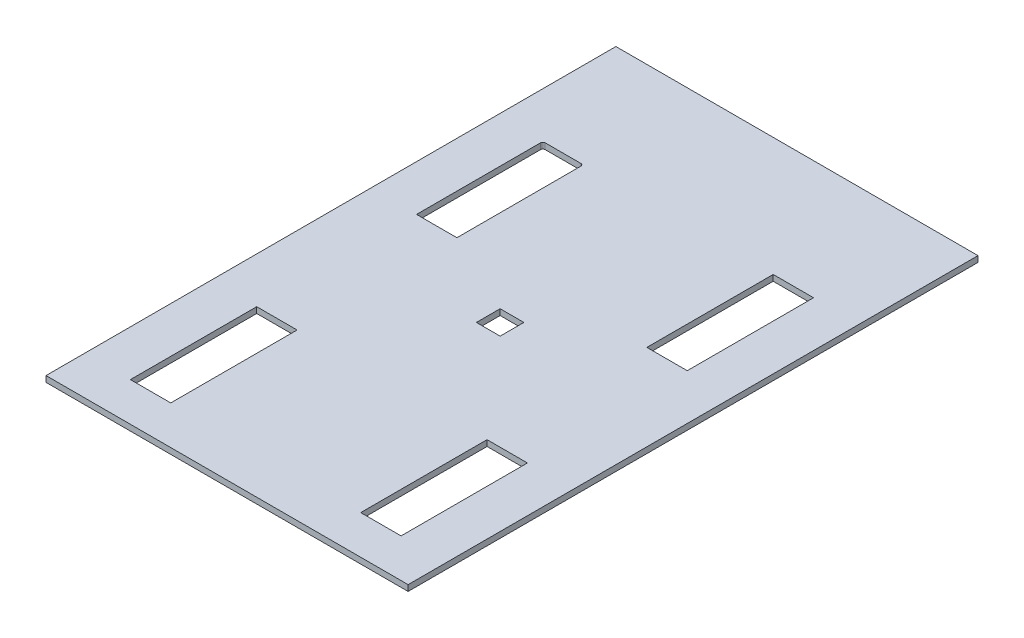
ISO-10303-21;
HEADER;
FILE_DESCRIPTION(('STEP AP214'),'2;1');
FILE_NAME('part.step','',(''),(''),'','','');
FILE_SCHEMA(('AUTOMOTIVE_DESIGN { 1 0 10303 214 1 1 1 1 }'));
ENDSEC;
DATA;
#1=APPLICATION_CONTEXT('core data for automotive mechanical design processes');
#2=APPLICATION_PROTOCOL_DEFINITION('international standard','automotive_design',2000,#1);
#3=PRODUCT_CONTEXT('',#1,'mechanical');
#4=PRODUCT('Part','Part','',(#3));
#5=PRODUCT_RELATED_PRODUCT_CATEGORY('part','',(#4));
#6=PRODUCT_DEFINITION_FORMATION('','',#4);
#7=PRODUCT_DEFINITION_CONTEXT('part definition',#1,'design');
#8=PRODUCT_DEFINITION('design','',#6,#7);
#9=PRODUCT_DEFINITION_SHAPE('','',#8);
#10=(LENGTH_UNIT() NAMED_UNIT(*) SI_UNIT(.MILLI.,.METRE.));
#11=(NAMED_UNIT(*) PLANE_ANGLE_UNIT() SI_UNIT($,.RADIAN.));
#12=(NAMED_UNIT(*) SI_UNIT($,.STERADIAN.) SOLID_ANGLE_UNIT());
#13=UNCERTAINTY_MEASURE_WITH_UNIT(LENGTH_MEASURE(1.E-05),#10,'distance_accuracy_value','');
#14=(GEOMETRIC_REPRESENTATION_CONTEXT(3) GLOBAL_UNCERTAINTY_ASSIGNED_CONTEXT((#13)) GLOBAL_UNIT_ASSIGNED_CONTEXT((#10,
#11,#12)) REPRESENTATION_CONTEXT('',''));
#15=CARTESIAN_POINT('',(0.,0.,0.));
#16=DIRECTION('',(0.,0.,1.));
#17=DIRECTION('',(1.,0.,0.));
#18=AXIS2_PLACEMENT_3D('',#15,#16,#17);
#19=CARTESIAN_POINT('',(0.,6.35,0.));
#20=DIRECTION('',(0.,-1.,0.));
#21=DIRECTION('',(0.,0.,-1.));
#22=AXIS2_PLACEMENT_3D('',#19,#20,#21);
#23=PLANE('',#22);
#24=DIRECTION('',(0.,0.,-1.));
#25=VECTOR('',#24,1.);
#26=CARTESIAN_POINT('',(193.675,6.35,304.8));
#27=LINE('',#26,#25);
#28=CARTESIAN_POINT('',(193.675,6.35,304.8));
#29=VERTEX_POINT('',#28);
#30=CARTESIAN_POINT('',(193.675,6.35,-304.8));
#31=VERTEX_POINT('',#30);
#32=EDGE_CURVE('E377',#29,#31,#27,.T.);
#33=ORIENTED_EDGE('',*,*,#32,.T.);
#34=DIRECTION('',(-1.,0.,0.));
#35=VECTOR('',#34,1.);
#36=CARTESIAN_POINT('',(-193.675,6.35,-304.8));
#37=LINE('',#36,#35);
#38=CARTESIAN_POINT('',(-193.675,6.35,-304.8));
#39=VERTEX_POINT('',#38);
#40=EDGE_CURVE('E380',#31,#39,#37,.T.);
#41=ORIENTED_EDGE('',*,*,#40,.T.);
#42=DIRECTION('',(0.,0.,1.));
#43=VECTOR('',#42,1.);
#44=CARTESIAN_POINT('',(-193.675,6.35,304.8));
#45=LINE('',#44,#43);
#46=CARTESIAN_POINT('',(-193.675,6.35,304.8));
#47=VERTEX_POINT('',#46);
#48=EDGE_CURVE('E383',#39,#47,#45,.T.);
#49=ORIENTED_EDGE('',*,*,#48,.T.);
#50=DIRECTION('',(1.,0.,0.));
#51=VECTOR('',#50,1.);
#52=CARTESIAN_POINT('',(-193.675,6.35,304.8));
#53=LINE('',#52,#51);
#54=EDGE_CURVE('E385',#47,#29,#53,.T.);
#55=ORIENTED_EDGE('',*,*,#54,.T.);
#56=EDGE_LOOP('',(#33,#41,#49,#55));
#57=FACE_BOUND('',#56,.T.);
#58=DIRECTION('',(-1.,0.,0.));
#59=VECTOR('',#58,1.);
#60=CARTESIAN_POINT('',(101.6,6.35,128.2954));
#61=LINE('',#60,#59);
#62=CARTESIAN_POINT('',(144.78,6.35,128.2954));
#63=VERTEX_POINT('',#62);
#64=CARTESIAN_POINT('',(101.6,6.35,128.2954));
#65=VERTEX_POINT('',#64);
#66=EDGE_CURVE('E360',#63,#65,#61,.T.);
#67=ORIENTED_EDGE('',*,*,#66,.F.);
#68=DIRECTION('',(0.,0.,-1.));
#69=VECTOR('',#68,1.);
#70=CARTESIAN_POINT('',(144.78,6.35,263.4234));
#71=LINE('',#70,#69);
#72=CARTESIAN_POINT('',(144.78,6.35,263.4234));
#73=VERTEX_POINT('',#72);
#74=EDGE_CURVE('E304',#73,#63,#71,.T.);
#75=ORIENTED_EDGE('',*,*,#74,.F.);
#76=DIRECTION('',(1.,0.,0.));
#77=VECTOR('',#76,1.);
#78=CARTESIAN_POINT('',(101.6,6.35,263.4234));
#79=LINE('',#78,#77);
#80=CARTESIAN_POINT('',(101.6,6.35,263.4234));
#81=VERTEX_POINT('',#80);
#82=EDGE_CURVE('E349',#81,#73,#79,.T.);
#83=ORIENTED_EDGE('',*,*,#82,.F.);
#84=DIRECTION('',(0.,0.,1.));
#85=VECTOR('',#84,1.);
#86=CARTESIAN_POINT('',(101.6,6.35,263.4234));
#87=LINE('',#86,#85);
#88=EDGE_CURVE('E363',#65,#81,#87,.T.);
#89=ORIENTED_EDGE('',*,*,#88,.F.);
#90=EDGE_LOOP('',(#67,#75,#83,#89));
#91=FACE_BOUND('',#90,.T.);
#92=DIRECTION('',(0.,0.,-1.));
#93=VECTOR('',#92,1.);
#94=CARTESIAN_POINT('',(-101.6,6.35,-42.672));
#95=LINE('',#94,#93);
#96=CARTESIAN_POINT('',(-101.6,6.35,-42.672));
#97=VERTEX_POINT('',#96);
#98=CARTESIAN_POINT('',(-101.6,6.35,-175.26));
#99=VERTEX_POINT('',#98);
#100=EDGE_CURVE('E268',#97,#99,#95,.T.);
#101=ORIENTED_EDGE('',*,*,#100,.F.);
#102=DIRECTION('',(1.,0.,0.));
#103=VECTOR('',#102,1.);
#104=CARTESIAN_POINT('',(-101.6,6.35,-42.672));
#105=LINE('',#104,#103);
#106=CARTESIAN_POINT('',(-144.78,6.35,-42.672));
#107=VERTEX_POINT('',#106);
#108=EDGE_CURVE('E270',#107,#97,#105,.T.);
#109=ORIENTED_EDGE('',*,*,#108,.F.);
#110=DIRECTION('',(0.,0.,1.));
#111=VECTOR('',#110,1.);
#112=CARTESIAN_POINT('',(-144.78,6.35,-42.672));
#113=LINE('',#112,#111);
#114=CARTESIAN_POINT('',(-144.78,6.35,-175.26));
#115=VERTEX_POINT('',#114);
#116=EDGE_CURVE('E262',#115,#107,#113,.T.);
#117=ORIENTED_EDGE('',*,*,#116,.F.);
#118=CARTESIAN_POINT('',(-142.24,6.35,-175.26));
#119=DIRECTION('',(0.,-1.,0.));
#120=DIRECTION('',(0.,0.,-1.));
#121=AXIS2_PLACEMENT_3D('',#118,#119,#120);
#122=CIRCLE('',#121,2.54);
#123=CARTESIAN_POINT('',(-142.24,6.35,-177.8));
#124=VERTEX_POINT('',#123);
#125=EDGE_CURVE('E415',#115,#124,#122,.T.);
#126=ORIENTED_EDGE('',*,*,#125,.T.);
#127=DIRECTION('',(-1.,0.,0.));
#128=VECTOR('',#127,1.);
#129=CARTESIAN_POINT('',(-101.6,6.35,-177.8));
#130=LINE('',#129,#128);
#131=CARTESIAN_POINT('',(-104.14,6.35,-177.8));
#132=VERTEX_POINT('',#131);
#133=EDGE_CURVE('E264',#132,#124,#130,.T.);
#134=ORIENTED_EDGE('',*,*,#133,.F.);
#135=CARTESIAN_POINT('',(-104.14,6.35,-175.26));
#136=DIRECTION('',(0.,-1.,0.));
#137=DIRECTION('',(0.,0.,-1.));
#138=AXIS2_PLACEMENT_3D('',#135,#136,#137);
#139=CIRCLE('',#138,2.54);
#140=EDGE_CURVE('E49',#132,#99,#139,.T.);
#141=ORIENTED_EDGE('',*,*,#140,.T.);
#142=EDGE_LOOP('',(#101,#109,#117,#126,#134,#141));
#143=FACE_BOUND('',#142,.T.);
#144=DIRECTION('',(0.,0.,-1.));
#145=VECTOR('',#144,1.);
#146=CARTESIAN_POINT('',(-101.6,6.35,263.4234));
#147=LINE('',#146,#145);
#148=CARTESIAN_POINT('',(-101.6,6.35,263.4234));
#149=VERTEX_POINT('',#148);
#150=CARTESIAN_POINT('',(-101.6,6.35,128.2954));
#151=VERTEX_POINT('',#150);
#152=EDGE_CURVE('E331',#149,#151,#147,.T.);
#153=ORIENTED_EDGE('',*,*,#152,.F.);
#154=DIRECTION('',(1.,0.,0.));
#155=VECTOR('',#154,1.);
#156=CARTESIAN_POINT('',(-101.6,6.35,263.4234));
#157=LINE('',#156,#155);
#158=CARTESIAN_POINT('',(-144.78,6.35,263.4234));
#159=VERTEX_POINT('',#158);
#160=EDGE_CURVE('E291',#159,#149,#157,.T.);
#161=ORIENTED_EDGE('',*,*,#160,.F.);
#162=DIRECTION('',(0.,0.,1.));
#163=VECTOR('',#162,1.);
#164=CARTESIAN_POINT('',(-144.78,6.35,263.4234));
#165=LINE('',#164,#163);
#166=CARTESIAN_POINT('',(-144.78,6.35,128.2954));
#167=VERTEX_POINT('',#166);
#168=EDGE_CURVE('E324',#167,#159,#165,.T.);
#169=ORIENTED_EDGE('',*,*,#168,.F.);
#170=DIRECTION('',(-1.,0.,0.));
#171=VECTOR('',#170,1.);
#172=CARTESIAN_POINT('',(-101.6,6.35,128.2954));
#173=LINE('',#172,#171);
#174=EDGE_CURVE('E327',#151,#167,#173,.T.);
#175=ORIENTED_EDGE('',*,*,#174,.F.);
#176=EDGE_LOOP('',(#153,#161,#169,#175));
#177=FACE_BOUND('',#176,.T.);
#178=DIRECTION('',(-1.,0.,0.));
#179=VECTOR('',#178,1.);
#180=CARTESIAN_POINT('',(101.6,6.35,-177.8));
#181=LINE('',#180,#179);
#182=CARTESIAN_POINT('',(144.78,6.35,-177.8));
#183=VERTEX_POINT('',#182);
#184=CARTESIAN_POINT('',(101.6,6.35,-177.8));
#185=VERTEX_POINT('',#184);
#186=EDGE_CURVE('E299',#183,#185,#181,.T.);
#187=ORIENTED_EDGE('',*,*,#186,.F.);
#188=DIRECTION('',(0.,0.,-1.));
#189=VECTOR('',#188,1.);
#190=CARTESIAN_POINT('',(144.78,6.35,-42.672));
#191=LINE('',#190,#189);
#192=CARTESIAN_POINT('',(144.78,6.35,-42.672));
#193=VERTEX_POINT('',#192);
#194=EDGE_CURVE('E302',#193,#183,#191,.T.);
#195=ORIENTED_EDGE('',*,*,#194,.F.);
#196=DIRECTION('',(1.,0.,0.));
#197=VECTOR('',#196,1.);
#198=CARTESIAN_POINT('',(101.6,6.35,-42.672));
#199=LINE('',#198,#197);
#200=CARTESIAN_POINT('',(101.6,6.35,-42.672));
#201=VERTEX_POINT('',#200);
#202=EDGE_CURVE('E292',#201,#193,#199,.T.);
#203=ORIENTED_EDGE('',*,*,#202,.F.);
#204=DIRECTION('',(0.,0.,1.));
#205=VECTOR('',#204,1.);
#206=CARTESIAN_POINT('',(101.6,6.35,-42.672));
#207=LINE('',#206,#205);
#208=EDGE_CURVE('E295',#185,#201,#207,.T.);
#209=ORIENTED_EDGE('',*,*,#208,.F.);
#210=EDGE_LOOP('',(#187,#195,#203,#209));
#211=FACE_BOUND('',#210,.T.);
#212=DIRECTION('',(0.,0.,-1.));
#213=VECTOR('',#212,1.);
#214=CARTESIAN_POINT('',(12.7,6.35,25.4));
#215=LINE('',#214,#213);
#216=CARTESIAN_POINT('',(12.7,6.35,25.4));
#217=VERTEX_POINT('',#216);
#218=CARTESIAN_POINT('',(12.7,6.35,0.));
#219=VERTEX_POINT('',#218);
#220=EDGE_CURVE('E215',#217,#219,#215,.T.);
#221=ORIENTED_EDGE('',*,*,#220,.F.);
#222=DIRECTION('',(1.,0.,0.));
#223=VECTOR('',#222,1.);
#224=CARTESIAN_POINT('',(-12.7,6.35,25.4));
#225=LINE('',#224,#223);
#226=CARTESIAN_POINT('',(-12.7,6.35,25.4));
#227=VERTEX_POINT('',#226);
#228=EDGE_CURVE('E240',#227,#217,#225,.T.);
#229=ORIENTED_EDGE('',*,*,#228,.F.);
#230=DIRECTION('',(0.,0.,1.));
#231=VECTOR('',#230,1.);
#232=CARTESIAN_POINT('',(-12.7,6.35,25.4));
#233=LINE('',#232,#231);
#234=CARTESIAN_POINT('',(-12.7,6.35,0.));
#235=VERTEX_POINT('',#234);
#236=EDGE_CURVE('E238',#235,#227,#233,.T.);
#237=ORIENTED_EDGE('',*,*,#236,.F.);
#238=DIRECTION('',(-1.,0.,0.));
#239=VECTOR('',#238,1.);
#240=CARTESIAN_POINT('',(-12.7,6.35,0.));
#241=LINE('',#240,#239);
#242=EDGE_CURVE('E225',#219,#235,#241,.T.);
#243=ORIENTED_EDGE('',*,*,#242,.F.);
#244=EDGE_LOOP('',(#221,#229,#237,#243));
#245=FACE_BOUND('',#244,.T.);
#246=ADVANCED_FACE('F41',(#57,#91,#143,#177,#211,#245),#23,.F.);
#247=CARTESIAN_POINT('',(0.,0.,0.));
#248=DIRECTION('',(0.,-1.,0.));
#249=DIRECTION('',(0.,0.,-1.));
#250=AXIS2_PLACEMENT_3D('',#247,#248,#249);
#251=PLANE('',#250);
#252=DIRECTION('',(0.,0.,-1.));
#253=VECTOR('',#252,1.);
#254=CARTESIAN_POINT('',(144.78,0.,-42.672));
#255=LINE('',#254,#253);
#256=CARTESIAN_POINT('',(144.78,0.,-42.672));
#257=VERTEX_POINT('',#256);
#258=CARTESIAN_POINT('',(144.78,0.,-177.8));
#259=VERTEX_POINT('',#258);
#260=EDGE_CURVE('E296',#257,#259,#255,.T.);
#261=ORIENTED_EDGE('',*,*,#260,.T.);
#262=DIRECTION('',(-1.,0.,0.));
#263=VECTOR('',#262,1.);
#264=CARTESIAN_POINT('',(101.6,0.,-177.8));
#265=LINE('',#264,#263);
#266=CARTESIAN_POINT('',(101.6,0.,-177.8));
#267=VERTEX_POINT('',#266);
#268=EDGE_CURVE('E310',#259,#267,#265,.T.);
#269=ORIENTED_EDGE('',*,*,#268,.T.);
#270=DIRECTION('',(0.,0.,1.));
#271=VECTOR('',#270,1.);
#272=CARTESIAN_POINT('',(101.6,0.,-42.672));
#273=LINE('',#272,#271);
#274=CARTESIAN_POINT('',(101.6,0.,-42.672));
#275=VERTEX_POINT('',#274);
#276=EDGE_CURVE('E307',#267,#275,#273,.T.);
#277=ORIENTED_EDGE('',*,*,#276,.T.);
#278=DIRECTION('',(1.,0.,0.));
#279=VECTOR('',#278,1.);
#280=CARTESIAN_POINT('',(101.6,0.,-42.672));
#281=LINE('',#280,#279);
#282=EDGE_CURVE('E284',#275,#257,#281,.T.);
#283=ORIENTED_EDGE('',*,*,#282,.T.);
#284=EDGE_LOOP('',(#261,#269,#277,#283));
#285=FACE_BOUND('',#284,.T.);
#286=DIRECTION('',(1.,0.,0.));
#287=VECTOR('',#286,1.);
#288=CARTESIAN_POINT('',(-101.6,0.,263.4234));
#289=LINE('',#288,#287);
#290=CARTESIAN_POINT('',(-144.78,0.,263.4234));
#291=VERTEX_POINT('',#290);
#292=CARTESIAN_POINT('',(-101.6,0.,263.4234));
#293=VERTEX_POINT('',#292);
#294=EDGE_CURVE('E328',#291,#293,#289,.T.);
#295=ORIENTED_EDGE('',*,*,#294,.T.);
#296=DIRECTION('',(0.,0.,-1.));
#297=VECTOR('',#296,1.);
#298=CARTESIAN_POINT('',(-101.6,0.,263.4234));
#299=LINE('',#298,#297);
#300=CARTESIAN_POINT('',(-101.6,0.,128.2954));
#301=VERTEX_POINT('',#300);
#302=EDGE_CURVE('E340',#293,#301,#299,.T.);
#303=ORIENTED_EDGE('',*,*,#302,.T.);
#304=DIRECTION('',(-1.,0.,0.));
#305=VECTOR('',#304,1.);
#306=CARTESIAN_POINT('',(-101.6,0.,128.2954));
#307=LINE('',#306,#305);
#308=CARTESIAN_POINT('',(-144.78,0.,128.2954));
#309=VERTEX_POINT('',#308);
#310=EDGE_CURVE('E337',#301,#309,#307,.T.);
#311=ORIENTED_EDGE('',*,*,#310,.T.);
#312=DIRECTION('',(0.,0.,1.));
#313=VECTOR('',#312,1.);
#314=CARTESIAN_POINT('',(-144.78,0.,263.4234));
#315=LINE('',#314,#313);
#316=EDGE_CURVE('E318',#309,#291,#315,.T.);
#317=ORIENTED_EDGE('',*,*,#316,.T.);
#318=EDGE_LOOP('',(#295,#303,#311,#317));
#319=FACE_BOUND('',#318,.T.);
#320=DIRECTION('',(1.,0.,0.));
#321=VECTOR('',#320,1.);
#322=CARTESIAN_POINT('',(-101.6,0.,-42.672));
#323=LINE('',#322,#321);
#324=CARTESIAN_POINT('',(-144.78,0.,-42.672));
#325=VERTEX_POINT('',#324);
#326=CARTESIAN_POINT('',(-101.6,0.,-42.672));
#327=VERTEX_POINT('',#326);
#328=EDGE_CURVE('E265',#325,#327,#323,.T.);
#329=ORIENTED_EDGE('',*,*,#328,.T.);
#330=DIRECTION('',(0.,0.,-1.));
#331=VECTOR('',#330,1.);
#332=CARTESIAN_POINT('',(-101.6,0.,-42.672));
#333=LINE('',#332,#331);
#334=CARTESIAN_POINT('',(-101.6,0.,-175.26));
#335=VERTEX_POINT('',#334);
#336=EDGE_CURVE('E277',#327,#335,#333,.T.);
#337=ORIENTED_EDGE('',*,*,#336,.T.);
#338=CARTESIAN_POINT('',(-104.14,0.,-175.26));
#339=DIRECTION('',(0.,-1.,0.));
#340=DIRECTION('',(0.,0.,-1.));
#341=AXIS2_PLACEMENT_3D('',#338,#339,#340);
#342=CIRCLE('',#341,2.54);
#343=CARTESIAN_POINT('',(-104.14,0.,-177.8));
#344=VERTEX_POINT('',#343);
#345=EDGE_CURVE('E11',#335,#344,#342,.F.);
#346=ORIENTED_EDGE('',*,*,#345,.T.);
#347=DIRECTION('',(-1.,0.,0.));
#348=VECTOR('',#347,1.);
#349=CARTESIAN_POINT('',(-101.6,0.,-177.8));
#350=LINE('',#349,#348);
#351=CARTESIAN_POINT('',(-142.24,0.,-177.8));
#352=VERTEX_POINT('',#351);
#353=EDGE_CURVE('E274',#344,#352,#350,.T.);
#354=ORIENTED_EDGE('',*,*,#353,.T.);
#355=CARTESIAN_POINT('',(-142.24,0.,-175.26));
#356=DIRECTION('',(0.,-1.,0.));
#357=DIRECTION('',(0.,0.,-1.));
#358=AXIS2_PLACEMENT_3D('',#355,#356,#357);
#359=CIRCLE('',#358,2.54);
#360=CARTESIAN_POINT('',(-144.78,0.,-175.26));
#361=VERTEX_POINT('',#360);
#362=EDGE_CURVE('E417',#352,#361,#359,.F.);
#363=ORIENTED_EDGE('',*,*,#362,.T.);
#364=DIRECTION('',(0.,0.,1.));
#365=VECTOR('',#364,1.);
#366=CARTESIAN_POINT('',(-144.78,0.,-42.672));
#367=LINE('',#366,#365);
#368=EDGE_CURVE('E259',#361,#325,#367,.T.);
#369=ORIENTED_EDGE('',*,*,#368,.T.);
#370=EDGE_LOOP('',(#329,#337,#346,#354,#363,#369));
#371=FACE_BOUND('',#370,.T.);
#372=DIRECTION('',(0.,0.,-1.));
#373=VECTOR('',#372,1.);
#374=CARTESIAN_POINT('',(144.78,0.,263.4234));
#375=LINE('',#374,#373);
#376=CARTESIAN_POINT('',(144.78,0.,263.4234));
#377=VERTEX_POINT('',#376);
#378=CARTESIAN_POINT('',(144.78,0.,128.2954));
#379=VERTEX_POINT('',#378);
#380=EDGE_CURVE('E345',#377,#379,#375,.T.);
#381=ORIENTED_EDGE('',*,*,#380,.T.);
#382=DIRECTION('',(-1.,0.,0.));
#383=VECTOR('',#382,1.);
#384=CARTESIAN_POINT('',(101.6,0.,128.2954));
#385=LINE('',#384,#383);
#386=CARTESIAN_POINT('',(101.6,0.,128.2954));
#387=VERTEX_POINT('',#386);
#388=EDGE_CURVE('E348',#379,#387,#385,.T.);
#389=ORIENTED_EDGE('',*,*,#388,.T.);
#390=DIRECTION('',(0.,0.,1.));
#391=VECTOR('',#390,1.);
#392=CARTESIAN_POINT('',(101.6,0.,263.4234));
#393=LINE('',#392,#391);
#394=CARTESIAN_POINT('',(101.6,0.,263.4234));
#395=VERTEX_POINT('',#394);
#396=EDGE_CURVE('E352',#387,#395,#393,.T.);
#397=ORIENTED_EDGE('',*,*,#396,.T.);
#398=DIRECTION('',(1.,0.,0.));
#399=VECTOR('',#398,1.);
#400=CARTESIAN_POINT('',(101.6,0.,263.4234));
#401=LINE('',#400,#399);
#402=EDGE_CURVE('E355',#395,#377,#401,.T.);
#403=ORIENTED_EDGE('',*,*,#402,.T.);
#404=EDGE_LOOP('',(#381,#389,#397,#403));
#405=FACE_BOUND('',#404,.T.);
#406=DIRECTION('',(0.,0.,-1.));
#407=VECTOR('',#406,1.);
#408=CARTESIAN_POINT('',(193.675,0.,304.8));
#409=LINE('',#408,#407);
#410=CARTESIAN_POINT('',(193.675,0.,304.8));
#411=VERTEX_POINT('',#410);
#412=CARTESIAN_POINT('',(193.675,0.,-304.8));
#413=VERTEX_POINT('',#412);
#414=EDGE_CURVE('E370',#411,#413,#409,.T.);
#415=ORIENTED_EDGE('',*,*,#414,.F.);
#416=DIRECTION('',(1.,0.,0.));
#417=VECTOR('',#416,1.);
#418=CARTESIAN_POINT('',(-193.675,0.,304.8));
#419=LINE('',#418,#417);
#420=CARTESIAN_POINT('',(-193.675,0.,304.8));
#421=VERTEX_POINT('',#420);
#422=EDGE_CURVE('E381',#421,#411,#419,.T.);
#423=ORIENTED_EDGE('',*,*,#422,.F.);
#424=DIRECTION('',(0.,0.,1.));
#425=VECTOR('',#424,1.);
#426=CARTESIAN_POINT('',(-193.675,0.,304.8));
#427=LINE('',#426,#425);
#428=CARTESIAN_POINT('',(-193.675,0.,-304.8));
#429=VERTEX_POINT('',#428);
#430=EDGE_CURVE('E392',#429,#421,#427,.T.);
#431=ORIENTED_EDGE('',*,*,#430,.F.);
#432=DIRECTION('',(-1.,0.,0.));
#433=VECTOR('',#432,1.);
#434=CARTESIAN_POINT('',(-193.675,0.,-304.8));
#435=LINE('',#434,#433);
#436=EDGE_CURVE('E390',#413,#429,#435,.T.);
#437=ORIENTED_EDGE('',*,*,#436,.F.);
#438=EDGE_LOOP('',(#415,#423,#431,#437));
#439=FACE_BOUND('',#438,.T.);
#440=DIRECTION('',(1.,0.,0.));
#441=VECTOR('',#440,1.);
#442=CARTESIAN_POINT('',(-12.7,0.,25.4));
#443=LINE('',#442,#441);
#444=CARTESIAN_POINT('',(-12.7,0.,25.4));
#445=VERTEX_POINT('',#444);
#446=CARTESIAN_POINT('',(12.7,0.,25.4));
#447=VERTEX_POINT('',#446);
#448=EDGE_CURVE('E226',#445,#447,#443,.T.);
#449=ORIENTED_EDGE('',*,*,#448,.T.);
#450=DIRECTION('',(0.,0.,-1.));
#451=VECTOR('',#450,1.);
#452=CARTESIAN_POINT('',(12.7,0.,25.4));
#453=LINE('',#452,#451);
#454=CARTESIAN_POINT('',(12.7,0.,0.));
#455=VERTEX_POINT('',#454);
#456=EDGE_CURVE('E244',#447,#455,#453,.T.);
#457=ORIENTED_EDGE('',*,*,#456,.T.);
#458=DIRECTION('',(-1.,0.,0.));
#459=VECTOR('',#458,1.);
#460=CARTESIAN_POINT('',(-12.7,0.,0.));
#461=LINE('',#460,#459);
#462=CARTESIAN_POINT('',(-12.7,0.,0.));
#463=VERTEX_POINT('',#462);
#464=EDGE_CURVE('E232',#455,#463,#461,.T.);
#465=ORIENTED_EDGE('',*,*,#464,.T.);
#466=DIRECTION('',(0.,0.,1.));
#467=VECTOR('',#466,1.);
#468=CARTESIAN_POINT('',(-12.7,0.,25.4));
#469=LINE('',#468,#467);
#470=EDGE_CURVE('E247',#463,#445,#469,.T.);
#471=ORIENTED_EDGE('',*,*,#470,.T.);
#472=EDGE_LOOP('',(#449,#457,#465,#471));
#473=FACE_BOUND('',#472,.T.);
#474=ADVANCED_FACE('F421',(#285,#319,#371,#405,#439,#473),#251,.T.);
#475=CARTESIAN_POINT('',(193.675,6.35,304.8));
#476=DIRECTION('',(-1.,0.,0.));
#477=DIRECTION('',(0.,0.,1.));
#478=AXIS2_PLACEMENT_3D('',#475,#476,#477);
#479=PLANE('',#478);
#480=ORIENTED_EDGE('',*,*,#414,.T.);
#481=DIRECTION('',(0.,-1.,0.));
#482=VECTOR('',#481,1.);
#483=CARTESIAN_POINT('',(193.675,6.35,-304.8));
#484=LINE('',#483,#482);
#485=EDGE_CURVE('E403',#31,#413,#484,.T.);
#486=ORIENTED_EDGE('',*,*,#485,.F.);
#487=ORIENTED_EDGE('',*,*,#32,.F.);
#488=DIRECTION('',(0.,-1.,0.));
#489=VECTOR('',#488,1.);
#490=CARTESIAN_POINT('',(193.675,6.35,304.8));
#491=LINE('',#490,#489);
#492=EDGE_CURVE('E387',#29,#411,#491,.T.);
#493=ORIENTED_EDGE('',*,*,#492,.T.);
#494=EDGE_LOOP('',(#480,#486,#487,#493));
#495=FACE_BOUND('',#494,.T.);
#496=ADVANCED_FACE('F463',(#495),#479,.F.);
#497=CARTESIAN_POINT('',(-193.675,6.35,-304.8));
#498=DIRECTION('',(0.,0.,1.));
#499=DIRECTION('',(1.,0.,0.));
#500=AXIS2_PLACEMENT_3D('',#497,#498,#499);
#501=PLANE('',#500);
#502=ORIENTED_EDGE('',*,*,#436,.T.);
#503=DIRECTION('',(0.,-1.,0.));
#504=VECTOR('',#503,1.);
#505=CARTESIAN_POINT('',(-193.675,6.35,-304.8));
#506=LINE('',#505,#504);
#507=EDGE_CURVE('E400',#39,#429,#506,.T.);
#508=ORIENTED_EDGE('',*,*,#507,.F.);
#509=ORIENTED_EDGE('',*,*,#40,.F.);
#510=ORIENTED_EDGE('',*,*,#485,.T.);
#511=EDGE_LOOP('',(#502,#508,#509,#510));
#512=FACE_BOUND('',#511,.T.);
#513=ADVANCED_FACE('F477',(#512),#501,.F.);
#514=CARTESIAN_POINT('',(-193.675,6.35,304.8));
#515=DIRECTION('',(1.,0.,0.));
#516=DIRECTION('',(0.,0.,-1.));
#517=AXIS2_PLACEMENT_3D('',#514,#515,#516);
#518=PLANE('',#517);
#519=ORIENTED_EDGE('',*,*,#430,.T.);
#520=DIRECTION('',(0.,-1.,0.));
#521=VECTOR('',#520,1.);
#522=CARTESIAN_POINT('',(-193.675,6.35,304.8));
#523=LINE('',#522,#521);
#524=EDGE_CURVE('E397',#47,#421,#523,.T.);
#525=ORIENTED_EDGE('',*,*,#524,.F.);
#526=ORIENTED_EDGE('',*,*,#48,.F.);
#527=ORIENTED_EDGE('',*,*,#507,.T.);
#528=EDGE_LOOP('',(#519,#525,#526,#527));
#529=FACE_BOUND('',#528,.T.);
#530=ADVANCED_FACE('F473',(#529),#518,.F.);
#531=CARTESIAN_POINT('',(-193.675,6.35,304.8));
#532=DIRECTION('',(0.,0.,-1.));
#533=DIRECTION('',(-1.,0.,0.));
#534=AXIS2_PLACEMENT_3D('',#531,#532,#533);
#535=PLANE('',#534);
#536=ORIENTED_EDGE('',*,*,#422,.T.);
#537=ORIENTED_EDGE('',*,*,#492,.F.);
#538=ORIENTED_EDGE('',*,*,#54,.F.);
#539=ORIENTED_EDGE('',*,*,#524,.T.);
#540=EDGE_LOOP('',(#536,#537,#538,#539));
#541=FACE_BOUND('',#540,.T.);
#542=ADVANCED_FACE('F470',(#541),#535,.F.);
#543=CARTESIAN_POINT('',(144.78,0.,263.4234));
#544=DIRECTION('',(1.,0.,0.));
#545=DIRECTION('',(0.,0.,-1.));
#546=AXIS2_PLACEMENT_3D('',#543,#544,#545);
#547=PLANE('',#546);
#548=ORIENTED_EDGE('',*,*,#74,.T.);
#549=DIRECTION('',(0.,1.,0.));
#550=VECTOR('',#549,1.);
#551=CARTESIAN_POINT('',(144.78,0.,128.2954));
#552=LINE('',#551,#550);
#553=EDGE_CURVE('E358',#379,#63,#552,.T.);
#554=ORIENTED_EDGE('',*,*,#553,.F.);
#555=ORIENTED_EDGE('',*,*,#380,.F.);
#556=DIRECTION('',(0.,1.,0.));
#557=VECTOR('',#556,1.);
#558=CARTESIAN_POINT('',(144.78,0.,263.4234));
#559=LINE('',#558,#557);
#560=EDGE_CURVE('E368',#377,#73,#559,.T.);
#561=ORIENTED_EDGE('',*,*,#560,.T.);
#562=EDGE_LOOP('',(#548,#554,#555,#561));
#563=FACE_BOUND('',#562,.T.);
#564=ADVANCED_FACE('F468',(#563),#547,.F.);
#565=CARTESIAN_POINT('',(101.6,0.,263.4234));
#566=DIRECTION('',(0.,0.,1.));
#567=DIRECTION('',(1.,0.,0.));
#568=AXIS2_PLACEMENT_3D('',#565,#566,#567);
#569=PLANE('',#568);
#570=ORIENTED_EDGE('',*,*,#82,.T.);
#571=ORIENTED_EDGE('',*,*,#560,.F.);
#572=ORIENTED_EDGE('',*,*,#402,.F.);
#573=DIRECTION('',(0.,1.,0.));
#574=VECTOR('',#573,1.);
#575=CARTESIAN_POINT('',(101.6,0.,263.4234));
#576=LINE('',#575,#574);
#577=EDGE_CURVE('E371',#395,#81,#576,.T.);
#578=ORIENTED_EDGE('',*,*,#577,.T.);
#579=EDGE_LOOP('',(#570,#571,#572,#578));
#580=FACE_BOUND('',#579,.T.);
#581=ADVANCED_FACE('F537',(#580),#569,.F.);
#582=CARTESIAN_POINT('',(101.6,0.,263.4234));
#583=DIRECTION('',(-1.,0.,0.));
#584=DIRECTION('',(0.,0.,1.));
#585=AXIS2_PLACEMENT_3D('',#582,#583,#584);
#586=PLANE('',#585);
#587=ORIENTED_EDGE('',*,*,#88,.T.);
#588=ORIENTED_EDGE('',*,*,#577,.F.);
#589=ORIENTED_EDGE('',*,*,#396,.F.);
#590=DIRECTION('',(0.,1.,0.));
#591=VECTOR('',#590,1.);
#592=CARTESIAN_POINT('',(101.6,0.,128.2954));
#593=LINE('',#592,#591);
#594=EDGE_CURVE('E373',#387,#65,#593,.T.);
#595=ORIENTED_EDGE('',*,*,#594,.T.);
#596=EDGE_LOOP('',(#587,#588,#589,#595));
#597=FACE_BOUND('',#596,.T.);
#598=ADVANCED_FACE('F452',(#597),#586,.F.);
#599=CARTESIAN_POINT('',(101.6,0.,128.2954));
#600=DIRECTION('',(0.,0.,-1.));
#601=DIRECTION('',(-1.,0.,0.));
#602=AXIS2_PLACEMENT_3D('',#599,#600,#601);
#603=PLANE('',#602);
#604=ORIENTED_EDGE('',*,*,#66,.T.);
#605=ORIENTED_EDGE('',*,*,#594,.F.);
#606=ORIENTED_EDGE('',*,*,#388,.F.);
#607=ORIENTED_EDGE('',*,*,#553,.T.);
#608=EDGE_LOOP('',(#604,#605,#606,#607));
#609=FACE_BOUND('',#608,.T.);
#610=ADVANCED_FACE('F444',(#609),#603,.F.);
#611=CARTESIAN_POINT('',(-101.6,0.,-42.672));
#612=DIRECTION('',(0.,0.,1.));
#613=DIRECTION('',(1.,0.,0.));
#614=AXIS2_PLACEMENT_3D('',#611,#612,#613);
#615=PLANE('',#614);
#616=ORIENTED_EDGE('',*,*,#108,.T.);
#617=DIRECTION('',(0.,1.,0.));
#618=VECTOR('',#617,1.);
#619=CARTESIAN_POINT('',(-101.6,0.,-42.672));
#620=LINE('',#619,#618);
#621=EDGE_CURVE('E256',#327,#97,#620,.T.);
#622=ORIENTED_EDGE('',*,*,#621,.F.);
#623=ORIENTED_EDGE('',*,*,#328,.F.);
#624=DIRECTION('',(0.,1.,0.));
#625=VECTOR('',#624,1.);
#626=CARTESIAN_POINT('',(-144.78,0.,-42.672));
#627=LINE('',#626,#625);
#628=EDGE_CURVE('E233',#325,#107,#627,.T.);
#629=ORIENTED_EDGE('',*,*,#628,.T.);
#630=EDGE_LOOP('',(#616,#622,#623,#629));
#631=FACE_BOUND('',#630,.T.);
#632=ADVANCED_FACE('F442',(#631),#615,.F.);
#633=CARTESIAN_POINT('',(-144.78,0.,-42.672));
#634=DIRECTION('',(-1.,0.,0.));
#635=DIRECTION('',(0.,0.,1.));
#636=AXIS2_PLACEMENT_3D('',#633,#634,#635);
#637=PLANE('',#636);
#638=ORIENTED_EDGE('',*,*,#368,.F.);
#639=DIRECTION('',(0.,1.,0.));
#640=VECTOR('',#639,1.);
#641=CARTESIAN_POINT('',(-144.78,6.35,-175.26));
#642=LINE('',#641,#640);
#643=EDGE_CURVE('E406',#361,#115,#642,.T.);
#644=ORIENTED_EDGE('',*,*,#643,.T.);
#645=ORIENTED_EDGE('',*,*,#116,.T.);
#646=ORIENTED_EDGE('',*,*,#628,.F.);
#647=EDGE_LOOP('',(#638,#644,#645,#646));
#648=FACE_BOUND('',#647,.T.);
#649=ADVANCED_FACE('F429',(#648),#637,.F.);
#650=CARTESIAN_POINT('',(-101.6,0.,-177.8));
#651=DIRECTION('',(0.,0.,-1.));
#652=DIRECTION('',(-1.,0.,0.));
#653=AXIS2_PLACEMENT_3D('',#650,#651,#652);
#654=PLANE('',#653);
#655=ORIENTED_EDGE('',*,*,#133,.T.);
#656=DIRECTION('',(0.,1.,0.));
#657=VECTOR('',#656,1.);
#658=CARTESIAN_POINT('',(-142.24,0.,-177.8));
#659=LINE('',#658,#657);
#660=EDGE_CURVE('E412',#124,#352,#659,.F.);
#661=ORIENTED_EDGE('',*,*,#660,.T.);
#662=ORIENTED_EDGE('',*,*,#353,.F.);
#663=DIRECTION('',(0.,1.,0.));
#664=VECTOR('',#663,1.);
#665=CARTESIAN_POINT('',(-104.14,6.35,-177.8));
#666=LINE('',#665,#664);
#667=EDGE_CURVE('E409',#344,#132,#666,.T.);
#668=ORIENTED_EDGE('',*,*,#667,.T.);
#669=EDGE_LOOP('',(#655,#661,#662,#668));
#670=FACE_BOUND('',#669,.T.);
#671=ADVANCED_FACE('F436',(#670),#654,.F.);
#672=CARTESIAN_POINT('',(-101.6,0.,-42.672));
#673=DIRECTION('',(1.,0.,0.));
#674=DIRECTION('',(0.,0.,-1.));
#675=AXIS2_PLACEMENT_3D('',#672,#673,#674);
#676=PLANE('',#675);
#677=ORIENTED_EDGE('',*,*,#100,.T.);
#678=DIRECTION('',(0.,1.,0.));
#679=VECTOR('',#678,1.);
#680=CARTESIAN_POINT('',(-101.6,0.,-175.26));
#681=LINE('',#680,#679);
#682=EDGE_CURVE('E56',#99,#335,#681,.F.);
#683=ORIENTED_EDGE('',*,*,#682,.T.);
#684=ORIENTED_EDGE('',*,*,#336,.F.);
#685=ORIENTED_EDGE('',*,*,#621,.T.);
#686=EDGE_LOOP('',(#677,#683,#684,#685));
#687=FACE_BOUND('',#686,.T.);
#688=ADVANCED_FACE('F440',(#687),#676,.F.);
#689=CARTESIAN_POINT('',(-101.6,0.,263.4234));
#690=DIRECTION('',(0.,0.,1.));
#691=DIRECTION('',(1.,0.,0.));
#692=AXIS2_PLACEMENT_3D('',#689,#690,#691);
#693=PLANE('',#692);
#694=ORIENTED_EDGE('',*,*,#160,.T.);
#695=DIRECTION('',(0.,1.,0.));
#696=VECTOR('',#695,1.);
#697=CARTESIAN_POINT('',(-101.6,0.,263.4234));
#698=LINE('',#697,#696);
#699=EDGE_CURVE('E315',#293,#149,#698,.T.);
#700=ORIENTED_EDGE('',*,*,#699,.F.);
#701=ORIENTED_EDGE('',*,*,#294,.F.);
#702=DIRECTION('',(0.,1.,0.));
#703=VECTOR('',#702,1.);
#704=CARTESIAN_POINT('',(-144.78,0.,263.4234));
#705=LINE('',#704,#703);
#706=EDGE_CURVE('E272',#291,#159,#705,.T.);
#707=ORIENTED_EDGE('',*,*,#706,.T.);
#708=EDGE_LOOP('',(#694,#700,#701,#707));
#709=FACE_BOUND('',#708,.T.);
#710=ADVANCED_FACE('F522',(#709),#693,.F.);
#711=CARTESIAN_POINT('',(-144.78,0.,263.4234));
#712=DIRECTION('',(-1.,0.,0.));
#713=DIRECTION('',(0.,0.,1.));
#714=AXIS2_PLACEMENT_3D('',#711,#712,#713);
#715=PLANE('',#714);
#716=ORIENTED_EDGE('',*,*,#168,.T.);
#717=ORIENTED_EDGE('',*,*,#706,.F.);
#718=ORIENTED_EDGE('',*,*,#316,.F.);
#719=DIRECTION('',(0.,1.,0.));
#720=VECTOR('',#719,1.);
#721=CARTESIAN_POINT('',(-144.78,0.,128.2954));
#722=LINE('',#721,#720);
#723=EDGE_CURVE('E321',#309,#167,#722,.T.);
#724=ORIENTED_EDGE('',*,*,#723,.T.);
#725=EDGE_LOOP('',(#716,#717,#718,#724));
#726=FACE_BOUND('',#725,.T.);
#727=ADVANCED_FACE('F524',(#726),#715,.F.);
#728=CARTESIAN_POINT('',(-101.6,0.,128.2954));
#729=DIRECTION('',(0.,0.,-1.));
#730=DIRECTION('',(-1.,0.,0.));
#731=AXIS2_PLACEMENT_3D('',#728,#729,#730);
#732=PLANE('',#731);
#733=ORIENTED_EDGE('',*,*,#174,.T.);
#734=ORIENTED_EDGE('',*,*,#723,.F.);
#735=ORIENTED_EDGE('',*,*,#310,.F.);
#736=DIRECTION('',(0.,1.,0.));
#737=VECTOR('',#736,1.);
#738=CARTESIAN_POINT('',(-101.6,0.,128.2954));
#739=LINE('',#738,#737);
#740=EDGE_CURVE('E319',#301,#151,#739,.T.);
#741=ORIENTED_EDGE('',*,*,#740,.T.);
#742=EDGE_LOOP('',(#733,#734,#735,#741));
#743=FACE_BOUND('',#742,.T.);
#744=ADVANCED_FACE('F529',(#743),#732,.F.);
#745=CARTESIAN_POINT('',(-101.6,0.,263.4234));
#746=DIRECTION('',(1.,0.,0.));
#747=DIRECTION('',(0.,0.,-1.));
#748=AXIS2_PLACEMENT_3D('',#745,#746,#747);
#749=PLANE('',#748);
#750=ORIENTED_EDGE('',*,*,#152,.T.);
#751=ORIENTED_EDGE('',*,*,#740,.F.);
#752=ORIENTED_EDGE('',*,*,#302,.F.);
#753=ORIENTED_EDGE('',*,*,#699,.T.);
#754=EDGE_LOOP('',(#750,#751,#752,#753));
#755=FACE_BOUND('',#754,.T.);
#756=ADVANCED_FACE('F526',(#755),#749,.F.);
#757=CARTESIAN_POINT('',(144.78,0.,-42.672));
#758=DIRECTION('',(1.,0.,0.));
#759=DIRECTION('',(0.,0.,-1.));
#760=AXIS2_PLACEMENT_3D('',#757,#758,#759);
#761=PLANE('',#760);
#762=ORIENTED_EDGE('',*,*,#194,.T.);
#763=DIRECTION('',(0.,1.,0.));
#764=VECTOR('',#763,1.);
#765=CARTESIAN_POINT('',(144.78,0.,-177.8));
#766=LINE('',#765,#764);
#767=EDGE_CURVE('E281',#259,#183,#766,.T.);
#768=ORIENTED_EDGE('',*,*,#767,.F.);
#769=ORIENTED_EDGE('',*,*,#260,.F.);
#770=DIRECTION('',(0.,1.,0.));
#771=VECTOR('',#770,1.);
#772=CARTESIAN_POINT('',(144.78,0.,-42.672));
#773=LINE('',#772,#771);
#774=EDGE_CURVE('E289',#257,#193,#773,.T.);
#775=ORIENTED_EDGE('',*,*,#774,.T.);
#776=EDGE_LOOP('',(#762,#768,#769,#775));
#777=FACE_BOUND('',#776,.T.);
#778=ADVANCED_FACE('F517',(#777),#761,.F.);
#779=CARTESIAN_POINT('',(101.6,0.,-42.672));
#780=DIRECTION('',(0.,0.,1.));
#781=DIRECTION('',(1.,0.,0.));
#782=AXIS2_PLACEMENT_3D('',#779,#780,#781);
#783=PLANE('',#782);
#784=ORIENTED_EDGE('',*,*,#202,.T.);
#785=ORIENTED_EDGE('',*,*,#774,.F.);
#786=ORIENTED_EDGE('',*,*,#282,.F.);
#787=DIRECTION('',(0.,1.,0.));
#788=VECTOR('',#787,1.);
#789=CARTESIAN_POINT('',(101.6,0.,-42.672));
#790=LINE('',#789,#788);
#791=EDGE_CURVE('E287',#275,#201,#790,.T.);
#792=ORIENTED_EDGE('',*,*,#791,.T.);
#793=EDGE_LOOP('',(#784,#785,#786,#792));
#794=FACE_BOUND('',#793,.T.);
#795=ADVANCED_FACE('F513',(#794),#783,.F.);
#796=CARTESIAN_POINT('',(101.6,0.,-42.672));
#797=DIRECTION('',(-1.,0.,0.));
#798=DIRECTION('',(0.,0.,1.));
#799=AXIS2_PLACEMENT_3D('',#796,#797,#798);
#800=PLANE('',#799);
#801=ORIENTED_EDGE('',*,*,#208,.T.);
#802=ORIENTED_EDGE('',*,*,#791,.F.);
#803=ORIENTED_EDGE('',*,*,#276,.F.);
#804=DIRECTION('',(0.,1.,0.));
#805=VECTOR('',#804,1.);
#806=CARTESIAN_POINT('',(101.6,0.,-177.8));
#807=LINE('',#806,#805);
#808=EDGE_CURVE('E285',#267,#185,#807,.T.);
#809=ORIENTED_EDGE('',*,*,#808,.T.);
#810=EDGE_LOOP('',(#801,#802,#803,#809));
#811=FACE_BOUND('',#810,.T.);
#812=ADVANCED_FACE('F507',(#811),#800,.F.);
#813=CARTESIAN_POINT('',(101.6,0.,-177.8));
#814=DIRECTION('',(0.,0.,-1.));
#815=DIRECTION('',(-1.,0.,0.));
#816=AXIS2_PLACEMENT_3D('',#813,#814,#815);
#817=PLANE('',#816);
#818=ORIENTED_EDGE('',*,*,#186,.T.);
#819=ORIENTED_EDGE('',*,*,#808,.F.);
#820=ORIENTED_EDGE('',*,*,#268,.F.);
#821=ORIENTED_EDGE('',*,*,#767,.T.);
#822=EDGE_LOOP('',(#818,#819,#820,#821));
#823=FACE_BOUND('',#822,.T.);
#824=ADVANCED_FACE('F503',(#823),#817,.F.);
#825=CARTESIAN_POINT('',(12.7,6.35,25.4));
#826=DIRECTION('',(-1.,0.,0.));
#827=DIRECTION('',(0.,0.,1.));
#828=AXIS2_PLACEMENT_3D('',#825,#826,#827);
#829=PLANE('',#828);
#830=ORIENTED_EDGE('',*,*,#456,.F.);
#831=DIRECTION('',(0.,-1.,0.));
#832=VECTOR('',#831,1.);
#833=CARTESIAN_POINT('',(12.7,6.35,25.4));
#834=LINE('',#833,#832);
#835=EDGE_CURVE('E221',#217,#447,#834,.T.);
#836=ORIENTED_EDGE('',*,*,#835,.F.);
#837=ORIENTED_EDGE('',*,*,#220,.T.);
#838=DIRECTION('',(0.,-1.,0.));
#839=VECTOR('',#838,1.);
#840=CARTESIAN_POINT('',(12.7,6.35,0.));
#841=LINE('',#840,#839);
#842=EDGE_CURVE('E218',#219,#455,#841,.T.);
#843=ORIENTED_EDGE('',*,*,#842,.T.);
#844=EDGE_LOOP('',(#830,#836,#837,#843));
#845=FACE_BOUND('',#844,.T.);
#846=ADVANCED_FACE('F217',(#845),#829,.T.);
#847=CARTESIAN_POINT('',(-12.7,6.35,0.));
#848=DIRECTION('',(0.,0.,1.));
#849=DIRECTION('',(1.,0.,0.));
#850=AXIS2_PLACEMENT_3D('',#847,#848,#849);
#851=PLANE('',#850);
#852=ORIENTED_EDGE('',*,*,#464,.F.);
#853=ORIENTED_EDGE('',*,*,#842,.F.);
#854=ORIENTED_EDGE('',*,*,#242,.T.);
#855=DIRECTION('',(0.,-1.,0.));
#856=VECTOR('',#855,1.);
#857=CARTESIAN_POINT('',(-12.7,6.35,0.));
#858=LINE('',#857,#856);
#859=EDGE_CURVE('E234',#235,#463,#858,.T.);
#860=ORIENTED_EDGE('',*,*,#859,.T.);
#861=EDGE_LOOP('',(#852,#853,#854,#860));
#862=FACE_BOUND('',#861,.T.);
#863=ADVANCED_FACE('F229',(#862),#851,.T.);
#864=CARTESIAN_POINT('',(-12.7,6.35,25.4));
#865=DIRECTION('',(1.,0.,0.));
#866=DIRECTION('',(0.,0.,-1.));
#867=AXIS2_PLACEMENT_3D('',#864,#865,#866);
#868=PLANE('',#867);
#869=ORIENTED_EDGE('',*,*,#470,.F.);
#870=ORIENTED_EDGE('',*,*,#859,.F.);
#871=ORIENTED_EDGE('',*,*,#236,.T.);
#872=DIRECTION('',(0.,-1.,0.));
#873=VECTOR('',#872,1.);
#874=CARTESIAN_POINT('',(-12.7,6.35,25.4));
#875=LINE('',#874,#873);
#876=EDGE_CURVE('E253',#227,#445,#875,.T.);
#877=ORIENTED_EDGE('',*,*,#876,.T.);
#878=EDGE_LOOP('',(#869,#870,#871,#877));
#879=FACE_BOUND('',#878,.T.);
#880=ADVANCED_FACE('F491',(#879),#868,.T.);
#881=CARTESIAN_POINT('',(-12.7,6.35,25.4));
#882=DIRECTION('',(0.,0.,-1.));
#883=DIRECTION('',(-1.,0.,0.));
#884=AXIS2_PLACEMENT_3D('',#881,#882,#883);
#885=PLANE('',#884);
#886=ORIENTED_EDGE('',*,*,#448,.F.);
#887=ORIENTED_EDGE('',*,*,#876,.F.);
#888=ORIENTED_EDGE('',*,*,#228,.T.);
#889=ORIENTED_EDGE('',*,*,#835,.T.);
#890=EDGE_LOOP('',(#886,#887,#888,#889));
#891=FACE_BOUND('',#890,.T.);
#892=ADVANCED_FACE('F485',(#891),#885,.T.);
#893=CARTESIAN_POINT('',(-142.24,0.,-175.26));
#894=DIRECTION('',(0.,-1.,0.));
#895=DIRECTION('',(0.,0.,-1.));
#896=AXIS2_PLACEMENT_3D('',#893,#894,#895);
#897=CYLINDRICAL_SURFACE('',#896,2.54);
#898=ORIENTED_EDGE('',*,*,#362,.F.);
#899=ORIENTED_EDGE('',*,*,#660,.F.);
#900=ORIENTED_EDGE('',*,*,#125,.F.);
#901=ORIENTED_EDGE('',*,*,#643,.F.);
#902=EDGE_LOOP('',(#898,#899,#900,#901));
#903=FACE_BOUND('',#902,.T.);
#904=ADVANCED_FACE('F432',(#903),#897,.F.);
#905=CARTESIAN_POINT('',(-104.14,0.,-175.26));
#906=DIRECTION('',(0.,-1.,0.));
#907=DIRECTION('',(0.,0.,-1.));
#908=AXIS2_PLACEMENT_3D('',#905,#906,#907);
#909=CYLINDRICAL_SURFACE('',#908,2.54);
#910=ORIENTED_EDGE('',*,*,#345,.F.);
#911=ORIENTED_EDGE('',*,*,#682,.F.);
#912=ORIENTED_EDGE('',*,*,#140,.F.);
#913=ORIENTED_EDGE('',*,*,#667,.F.);
#914=EDGE_LOOP('',(#910,#911,#912,#913));
#915=FACE_BOUND('',#914,.T.);
#916=ADVANCED_FACE('F43',(#915),#909,.F.);
#917=CLOSED_SHELL('',(#246,#474,#496,#513,#530,#542,#564,#581,#598,#610,#632,#649,#671,#688,
#710,#727,#744,#756,#778,#795,#812,#824,#846,#863,#880,#892,#904,#916));
#918=MANIFOLD_SOLID_BREP('B2',#917);
#919=ADVANCED_BREP_SHAPE_REPRESENTATION('',(#18,#918),#14);
#920=SHAPE_DEFINITION_REPRESENTATION(#9,#919);
ENDSEC;
END-ISO-10303-21;
